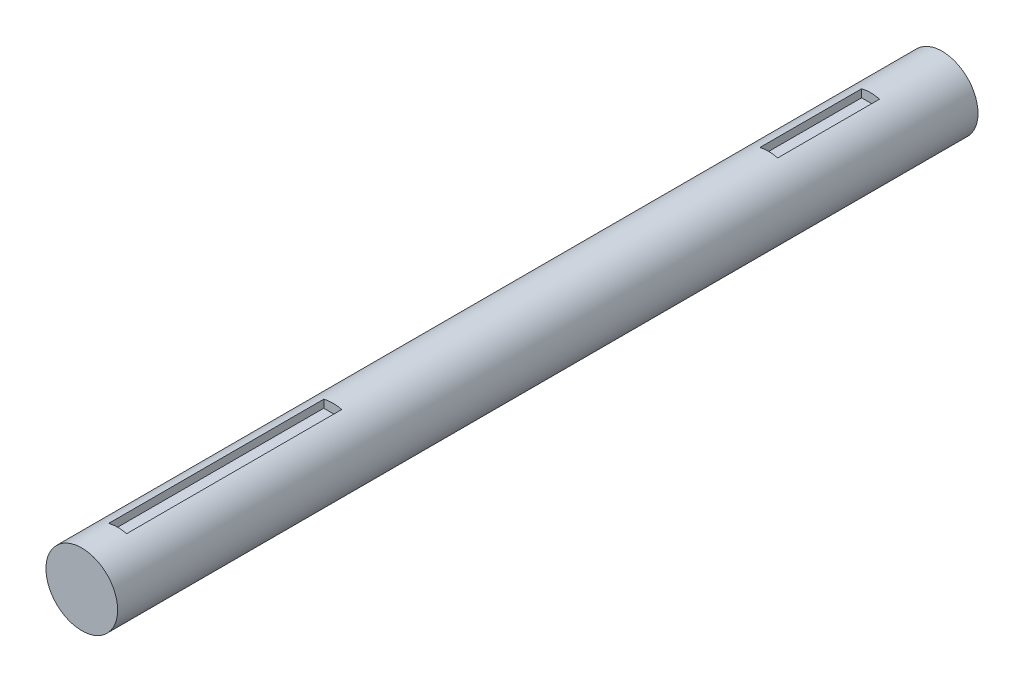
ISO-10303-21;
HEADER;
FILE_DESCRIPTION(('STEP AP214'),'2;1');
FILE_NAME('part.step','',(''),(''),'','','');
FILE_SCHEMA(('AUTOMOTIVE_DESIGN { 1 0 10303 214 1 1 1 1 }'));
ENDSEC;
DATA;
#1=APPLICATION_CONTEXT('core data for automotive mechanical design processes');
#2=APPLICATION_PROTOCOL_DEFINITION('international standard','automotive_design',2000,#1);
#3=PRODUCT_CONTEXT('',#1,'mechanical');
#4=PRODUCT('Part','Part','',(#3));
#5=PRODUCT_RELATED_PRODUCT_CATEGORY('part','',(#4));
#6=PRODUCT_DEFINITION_FORMATION('','',#4);
#7=PRODUCT_DEFINITION_CONTEXT('part definition',#1,'design');
#8=PRODUCT_DEFINITION('design','',#6,#7);
#9=PRODUCT_DEFINITION_SHAPE('','',#8);
#10=(LENGTH_UNIT() NAMED_UNIT(*) SI_UNIT(.MILLI.,.METRE.));
#11=(NAMED_UNIT(*) PLANE_ANGLE_UNIT() SI_UNIT($,.RADIAN.));
#12=(NAMED_UNIT(*) SI_UNIT($,.STERADIAN.) SOLID_ANGLE_UNIT());
#13=UNCERTAINTY_MEASURE_WITH_UNIT(LENGTH_MEASURE(1.E-05),#10,'distance_accuracy_value','');
#14=(GEOMETRIC_REPRESENTATION_CONTEXT(3) GLOBAL_UNCERTAINTY_ASSIGNED_CONTEXT((#13)) GLOBAL_UNIT_ASSIGNED_CONTEXT((#10,
#11,#12)) REPRESENTATION_CONTEXT('',''));
#15=CARTESIAN_POINT('',(0.,0.,0.));
#16=DIRECTION('',(0.,0.,1.));
#17=DIRECTION('',(1.,0.,0.));
#18=AXIS2_PLACEMENT_3D('',#15,#16,#17);
#19=CARTESIAN_POINT('',(0.,0.,152.4));
#20=DIRECTION('',(0.,0.,-1.));
#21=DIRECTION('',(-1.,0.,0.));
#22=AXIS2_PLACEMENT_3D('',#19,#20,#21);
#23=CYLINDRICAL_SURFACE('',#22,6.35);
#24=CARTESIAN_POINT('',(0.,0.,30.734));
#25=DIRECTION('',(0.,0.,-1.));
#26=DIRECTION('',(-1.,0.,0.));
#27=AXIS2_PLACEMENT_3D('',#24,#25,#26);
#28=CIRCLE('',#27,6.35);
#29=CARTESIAN_POINT('',(-1.57143332462789,6.15248708298107,30.734));
#30=VERTEX_POINT('',#29);
#31=CARTESIAN_POINT('',(1.60356667537211,6.1441902572785,30.734));
#32=VERTEX_POINT('',#31);
#33=EDGE_CURVE('E161',#30,#32,#28,.T.);
#34=ORIENTED_EDGE('',*,*,#33,.F.);
#35=DIRECTION('',(0.,0.,-1.));
#36=VECTOR('',#35,1.);
#37=CARTESIAN_POINT('',(-1.57143332462789,6.15248708298107,152.4));
#38=LINE('',#37,#36);
#39=CARTESIAN_POINT('',(-1.57143332462789,6.15248708298107,12.7));
#40=VERTEX_POINT('',#39);
#41=EDGE_CURVE('E155',#30,#40,#38,.T.);
#42=ORIENTED_EDGE('',*,*,#41,.T.);
#43=CARTESIAN_POINT('',(0.,0.,12.7));
#44=DIRECTION('',(0.,0.,-1.));
#45=DIRECTION('',(-1.,0.,0.));
#46=AXIS2_PLACEMENT_3D('',#43,#44,#45);
#47=CIRCLE('',#46,6.35);
#48=CARTESIAN_POINT('',(1.60356667537211,6.1441902572785,12.7));
#49=VERTEX_POINT('',#48);
#50=EDGE_CURVE('E150',#40,#49,#47,.T.);
#51=ORIENTED_EDGE('',*,*,#50,.T.);
#52=DIRECTION('',(0.,0.,-1.));
#53=VECTOR('',#52,1.);
#54=CARTESIAN_POINT('',(1.60356667537211,6.1441902572785,152.4));
#55=LINE('',#54,#53);
#56=EDGE_CURVE('E158',#49,#32,#55,.F.);
#57=ORIENTED_EDGE('',*,*,#56,.T.);
#58=EDGE_LOOP('',(#34,#42,#51,#57));
#59=FACE_BOUND('',#58,.T.);
#60=CARTESIAN_POINT('',(0.,0.,152.4));
#61=DIRECTION('',(0.,0.,1.));
#62=DIRECTION('',(1.,0.,0.));
#63=AXIS2_PLACEMENT_3D('',#60,#61,#62);
#64=CIRCLE('',#63,6.35);
#65=CARTESIAN_POINT('',(6.35,0.,152.4));
#66=VERTEX_POINT('',#65);
#67=EDGE_CURVE('E147',#66,#66,#64,.T.);
#68=ORIENTED_EDGE('',*,*,#67,.F.);
#69=EDGE_LOOP('',(#68));
#70=FACE_BOUND('',#69,.T.);
#71=CARTESIAN_POINT('',(0.,0.,0.));
#72=DIRECTION('',(0.,0.,1.));
#73=DIRECTION('',(1.,0.,0.));
#74=AXIS2_PLACEMENT_3D('',#71,#72,#73);
#75=CIRCLE('',#74,6.35);
#76=CARTESIAN_POINT('',(6.35,0.,0.));
#77=VERTEX_POINT('',#76);
#78=EDGE_CURVE('E145',#77,#77,#75,.T.);
#79=ORIENTED_EDGE('',*,*,#78,.T.);
#80=EDGE_LOOP('',(#79));
#81=FACE_BOUND('',#80,.T.);
#82=CARTESIAN_POINT('',(0.,0.,107.95));
#83=DIRECTION('',(0.,0.,1.));
#84=DIRECTION('',(1.,0.,0.));
#85=AXIS2_PLACEMENT_3D('',#82,#83,#84);
#86=CIRCLE('',#85,6.35);
#87=CARTESIAN_POINT('',(1.5875,6.14836106210427,107.95));
#88=VERTEX_POINT('',#87);
#89=CARTESIAN_POINT('',(-1.5875,6.14836106210428,107.95));
#90=VERTEX_POINT('',#89);
#91=EDGE_CURVE('E11',#88,#90,#86,.T.);
#92=ORIENTED_EDGE('',*,*,#91,.F.);
#93=DIRECTION('',(0.,0.,-1.));
#94=VECTOR('',#93,1.);
#95=CARTESIAN_POINT('',(1.5875,6.14836106210427,152.4));
#96=LINE('',#95,#94);
#97=CARTESIAN_POINT('',(1.5875,6.14836106210427,146.05));
#98=VERTEX_POINT('',#97);
#99=EDGE_CURVE('E112',#88,#98,#96,.F.);
#100=ORIENTED_EDGE('',*,*,#99,.T.);
#101=CARTESIAN_POINT('',(0.,0.,146.05));
#102=DIRECTION('',(0.,0.,1.));
#103=DIRECTION('',(1.,0.,0.));
#104=AXIS2_PLACEMENT_3D('',#101,#102,#103);
#105=CIRCLE('',#104,6.35);
#106=CARTESIAN_POINT('',(-1.5875,6.14836106210428,146.05));
#107=VERTEX_POINT('',#106);
#108=EDGE_CURVE('E163',#98,#107,#105,.T.);
#109=ORIENTED_EDGE('',*,*,#108,.T.);
#110=DIRECTION('',(0.,0.,-1.));
#111=VECTOR('',#110,1.);
#112=CARTESIAN_POINT('',(-1.5875,6.14836106210427,152.4));
#113=LINE('',#112,#111);
#114=EDGE_CURVE('E39',#107,#90,#113,.T.);
#115=ORIENTED_EDGE('',*,*,#114,.T.);
#116=EDGE_LOOP('',(#92,#100,#109,#115));
#117=FACE_BOUND('',#116,.T.);
#118=ADVANCED_FACE('F32',(#59,#70,#81,#117),#23,.T.);
#119=CARTESIAN_POINT('',(0.,0.,152.4));
#120=DIRECTION('',(0.,0.,1.));
#121=DIRECTION('',(1.,0.,0.));
#122=AXIS2_PLACEMENT_3D('',#119,#120,#121);
#123=PLANE('',#122);
#124=ORIENTED_EDGE('',*,*,#67,.T.);
#125=EDGE_LOOP('',(#124));
#126=FACE_BOUND('',#125,.T.);
#127=ADVANCED_FACE('F181',(#126),#123,.T.);
#128=CARTESIAN_POINT('',(0.,0.,0.));
#129=DIRECTION('',(0.,0.,1.));
#130=DIRECTION('',(1.,0.,0.));
#131=AXIS2_PLACEMENT_3D('',#128,#129,#130);
#132=PLANE('',#131);
#133=ORIENTED_EDGE('',*,*,#78,.F.);
#134=EDGE_LOOP('',(#133));
#135=FACE_BOUND('',#134,.T.);
#136=ADVANCED_FACE('F186',(#135),#132,.F.);
#137=CARTESIAN_POINT('',(1.60356667537211,7.9375,30.734));
#138=DIRECTION('',(1.,0.,0.));
#139=DIRECTION('',(0.,1.,0.));
#140=AXIS2_PLACEMENT_3D('',#137,#138,#139);
#141=PLANE('',#140);
#142=DIRECTION('',(0.,-1.,0.));
#143=VECTOR('',#142,1.);
#144=CARTESIAN_POINT('',(1.60356667537211,7.9375,12.7));
#145=LINE('',#144,#143);
#146=CARTESIAN_POINT('',(1.60356667537211,4.7625,12.7));
#147=VERTEX_POINT('',#146);
#148=EDGE_CURVE('E54',#49,#147,#145,.T.);
#149=ORIENTED_EDGE('',*,*,#148,.T.);
#150=DIRECTION('',(0.,0.,-1.));
#151=VECTOR('',#150,1.);
#152=CARTESIAN_POINT('',(1.60356667537211,4.7625,30.734));
#153=LINE('',#152,#151);
#154=CARTESIAN_POINT('',(1.60356667537211,4.7625,30.734));
#155=VERTEX_POINT('',#154);
#156=EDGE_CURVE('E142',#155,#147,#153,.T.);
#157=ORIENTED_EDGE('',*,*,#156,.F.);
#158=DIRECTION('',(0.,-1.,0.));
#159=VECTOR('',#158,1.);
#160=CARTESIAN_POINT('',(1.60356667537211,7.9375,30.734));
#161=LINE('',#160,#159);
#162=EDGE_CURVE('E133',#32,#155,#161,.T.);
#163=ORIENTED_EDGE('',*,*,#162,.F.);
#164=ORIENTED_EDGE('',*,*,#56,.F.);
#165=EDGE_LOOP('',(#149,#157,#163,#164));
#166=FACE_BOUND('',#165,.T.);
#167=ADVANCED_FACE('F196',(#166),#141,.F.);
#168=CARTESIAN_POINT('',(-1.57143332462789,4.7625,30.734));
#169=DIRECTION('',(-1.,0.,0.));
#170=DIRECTION('',(0.,0.,1.));
#171=AXIS2_PLACEMENT_3D('',#168,#169,#170);
#172=PLANE('',#171);
#173=DIRECTION('',(0.,1.,0.));
#174=VECTOR('',#173,1.);
#175=CARTESIAN_POINT('',(-1.57143332462789,4.7625,30.734));
#176=LINE('',#175,#174);
#177=CARTESIAN_POINT('',(-1.57143332462789,4.7625,30.734));
#178=VERTEX_POINT('',#177);
#179=EDGE_CURVE('E130',#178,#30,#176,.T.);
#180=ORIENTED_EDGE('',*,*,#179,.F.);
#181=DIRECTION('',(0.,0.,-1.));
#182=VECTOR('',#181,1.);
#183=CARTESIAN_POINT('',(-1.57143332462789,4.7625,30.734));
#184=LINE('',#183,#182);
#185=CARTESIAN_POINT('',(-1.57143332462789,4.7625,12.7));
#186=VERTEX_POINT('',#185);
#187=EDGE_CURVE('E135',#178,#186,#184,.T.);
#188=ORIENTED_EDGE('',*,*,#187,.T.);
#189=DIRECTION('',(0.,1.,0.));
#190=VECTOR('',#189,1.);
#191=CARTESIAN_POINT('',(-1.57143332462789,4.7625,12.7));
#192=LINE('',#191,#190);
#193=EDGE_CURVE('E138',#186,#40,#192,.T.);
#194=ORIENTED_EDGE('',*,*,#193,.T.);
#195=ORIENTED_EDGE('',*,*,#41,.F.);
#196=EDGE_LOOP('',(#180,#188,#194,#195));
#197=FACE_BOUND('',#196,.T.);
#198=ADVANCED_FACE('F200',(#197),#172,.F.);
#199=CARTESIAN_POINT('',(0.,0.,30.734));
#200=DIRECTION('',(0.,0.,-1.));
#201=DIRECTION('',(-1.,0.,0.));
#202=AXIS2_PLACEMENT_3D('',#199,#200,#201);
#203=PLANE('',#202);
#204=ORIENTED_EDGE('',*,*,#33,.T.);
#205=ORIENTED_EDGE('',*,*,#162,.T.);
#206=DIRECTION('',(-1.,0.,0.));
#207=VECTOR('',#206,1.);
#208=CARTESIAN_POINT('',(0.0160666753721095,4.7625,30.734));
#209=LINE('',#208,#207);
#210=EDGE_CURVE('E128',#155,#178,#209,.T.);
#211=ORIENTED_EDGE('',*,*,#210,.T.);
#212=ORIENTED_EDGE('',*,*,#179,.T.);
#213=EDGE_LOOP('',(#204,#205,#211,#212));
#214=FACE_BOUND('',#213,.T.);
#215=ADVANCED_FACE('F210',(#214),#203,.T.);
#216=CARTESIAN_POINT('',(0.,0.,12.7));
#217=DIRECTION('',(0.,0.,-1.));
#218=DIRECTION('',(-1.,0.,0.));
#219=AXIS2_PLACEMENT_3D('',#216,#217,#218);
#220=PLANE('',#219);
#221=ORIENTED_EDGE('',*,*,#193,.F.);
#222=DIRECTION('',(-1.,0.,0.));
#223=VECTOR('',#222,1.);
#224=CARTESIAN_POINT('',(-1.57143332462789,4.7625,12.7));
#225=LINE('',#224,#223);
#226=EDGE_CURVE('E126',#147,#186,#225,.T.);
#227=ORIENTED_EDGE('',*,*,#226,.F.);
#228=ORIENTED_EDGE('',*,*,#148,.F.);
#229=ORIENTED_EDGE('',*,*,#50,.F.);
#230=EDGE_LOOP('',(#221,#227,#228,#229));
#231=FACE_BOUND('',#230,.T.);
#232=ADVANCED_FACE('F207',(#231),#220,.F.);
#233=CARTESIAN_POINT('',(-1.57143332462789,4.7625,30.734));
#234=DIRECTION('',(0.,-1.,0.));
#235=DIRECTION('',(1.,0.,0.));
#236=AXIS2_PLACEMENT_3D('',#233,#234,#235);
#237=PLANE('',#236);
#238=ORIENTED_EDGE('',*,*,#226,.T.);
#239=ORIENTED_EDGE('',*,*,#187,.F.);
#240=ORIENTED_EDGE('',*,*,#210,.F.);
#241=ORIENTED_EDGE('',*,*,#156,.T.);
#242=EDGE_LOOP('',(#238,#239,#240,#241));
#243=FACE_BOUND('',#242,.T.);
#244=ADVANCED_FACE('F204',(#243),#237,.F.);
#245=CARTESIAN_POINT('',(-1.5875,0.,107.95));
#246=DIRECTION('',(-1.,0.,0.));
#247=DIRECTION('',(0.,-1.,0.));
#248=AXIS2_PLACEMENT_3D('',#245,#246,#247);
#249=PLANE('',#248);
#250=DIRECTION('',(0.,-1.,0.));
#251=VECTOR('',#250,1.);
#252=CARTESIAN_POINT('',(-1.5875,0.,146.05));
#253=LINE('',#252,#251);
#254=CARTESIAN_POINT('',(-1.5875,4.7625,146.05));
#255=VERTEX_POINT('',#254);
#256=EDGE_CURVE('E46',#107,#255,#253,.T.);
#257=ORIENTED_EDGE('',*,*,#256,.T.);
#258=DIRECTION('',(0.,0.,1.));
#259=VECTOR('',#258,1.);
#260=CARTESIAN_POINT('',(-1.5875,4.7625,107.95));
#261=LINE('',#260,#259);
#262=CARTESIAN_POINT('',(-1.5875,4.7625,107.95));
#263=VERTEX_POINT('',#262);
#264=EDGE_CURVE('E105',#263,#255,#261,.T.);
#265=ORIENTED_EDGE('',*,*,#264,.F.);
#266=DIRECTION('',(0.,-1.,0.));
#267=VECTOR('',#266,1.);
#268=CARTESIAN_POINT('',(-1.5875,0.,107.95));
#269=LINE('',#268,#267);
#270=EDGE_CURVE('E106',#90,#263,#269,.T.);
#271=ORIENTED_EDGE('',*,*,#270,.F.);
#272=ORIENTED_EDGE('',*,*,#114,.F.);
#273=EDGE_LOOP('',(#257,#265,#271,#272));
#274=FACE_BOUND('',#273,.T.);
#275=ADVANCED_FACE('F169',(#274),#249,.F.);
#276=CARTESIAN_POINT('',(1.5875,0.,107.95));
#277=DIRECTION('',(1.,0.,0.));
#278=DIRECTION('',(0.,0.,-1.));
#279=AXIS2_PLACEMENT_3D('',#276,#277,#278);
#280=PLANE('',#279);
#281=DIRECTION('',(0.,1.,0.));
#282=VECTOR('',#281,1.);
#283=CARTESIAN_POINT('',(1.5875,0.,107.95));
#284=LINE('',#283,#282);
#285=CARTESIAN_POINT('',(1.5875,4.7625,107.95));
#286=VERTEX_POINT('',#285);
#287=EDGE_CURVE('E109',#286,#88,#284,.T.);
#288=ORIENTED_EDGE('',*,*,#287,.F.);
#289=DIRECTION('',(0.,0.,1.));
#290=VECTOR('',#289,1.);
#291=CARTESIAN_POINT('',(1.5875,4.7625,107.95));
#292=LINE('',#291,#290);
#293=CARTESIAN_POINT('',(1.5875,4.7625,146.05));
#294=VERTEX_POINT('',#293);
#295=EDGE_CURVE('E95',#286,#294,#292,.T.);
#296=ORIENTED_EDGE('',*,*,#295,.T.);
#297=DIRECTION('',(0.,1.,0.));
#298=VECTOR('',#297,1.);
#299=CARTESIAN_POINT('',(1.5875,0.,146.05));
#300=LINE('',#299,#298);
#301=EDGE_CURVE('E120',#294,#98,#300,.T.);
#302=ORIENTED_EDGE('',*,*,#301,.T.);
#303=ORIENTED_EDGE('',*,*,#99,.F.);
#304=EDGE_LOOP('',(#288,#296,#302,#303));
#305=FACE_BOUND('',#304,.T.);
#306=ADVANCED_FACE('F110',(#305),#280,.F.);
#307=CARTESIAN_POINT('',(0.,0.,107.95));
#308=DIRECTION('',(0.,0.,1.));
#309=DIRECTION('',(1.,0.,0.));
#310=AXIS2_PLACEMENT_3D('',#307,#308,#309);
#311=PLANE('',#310);
#312=ORIENTED_EDGE('',*,*,#91,.T.);
#313=ORIENTED_EDGE('',*,*,#270,.T.);
#314=DIRECTION('',(1.,0.,0.));
#315=VECTOR('',#314,1.);
#316=CARTESIAN_POINT('',(0.,4.7625,107.95));
#317=LINE('',#316,#315);
#318=EDGE_CURVE('E100',#263,#286,#317,.T.);
#319=ORIENTED_EDGE('',*,*,#318,.T.);
#320=ORIENTED_EDGE('',*,*,#287,.T.);
#321=EDGE_LOOP('',(#312,#313,#319,#320));
#322=FACE_BOUND('',#321,.T.);
#323=ADVANCED_FACE('F116',(#322),#311,.T.);
#324=CARTESIAN_POINT('',(0.,0.,146.05));
#325=DIRECTION('',(0.,0.,1.));
#326=DIRECTION('',(1.,0.,0.));
#327=AXIS2_PLACEMENT_3D('',#324,#325,#326);
#328=PLANE('',#327);
#329=ORIENTED_EDGE('',*,*,#301,.F.);
#330=DIRECTION('',(1.,0.,0.));
#331=VECTOR('',#330,1.);
#332=CARTESIAN_POINT('',(0.,4.7625,146.05));
#333=LINE('',#332,#331);
#334=EDGE_CURVE('E101',#255,#294,#333,.T.);
#335=ORIENTED_EDGE('',*,*,#334,.F.);
#336=ORIENTED_EDGE('',*,*,#256,.F.);
#337=ORIENTED_EDGE('',*,*,#108,.F.);
#338=EDGE_LOOP('',(#329,#335,#336,#337));
#339=FACE_BOUND('',#338,.T.);
#340=ADVANCED_FACE('F170',(#339),#328,.F.);
#341=CARTESIAN_POINT('',(0.,4.7625,107.95));
#342=DIRECTION('',(0.,-1.,0.));
#343=DIRECTION('',(0.,0.,-1.));
#344=AXIS2_PLACEMENT_3D('',#341,#342,#343);
#345=PLANE('',#344);
#346=ORIENTED_EDGE('',*,*,#334,.T.);
#347=ORIENTED_EDGE('',*,*,#295,.F.);
#348=ORIENTED_EDGE('',*,*,#318,.F.);
#349=ORIENTED_EDGE('',*,*,#264,.T.);
#350=EDGE_LOOP('',(#346,#347,#348,#349));
#351=FACE_BOUND('',#350,.T.);
#352=ADVANCED_FACE('F97',(#351),#345,.F.);
#353=CLOSED_SHELL('',(#118,#127,#136,#167,#198,#215,#232,#244,#275,#306,#323,#340,#352));
#354=MANIFOLD_SOLID_BREP('B2',#353);
#355=ADVANCED_BREP_SHAPE_REPRESENTATION('',(#18,#354),#14);
#356=SHAPE_DEFINITION_REPRESENTATION(#9,#355);
ENDSEC;
END-ISO-10303-21;
